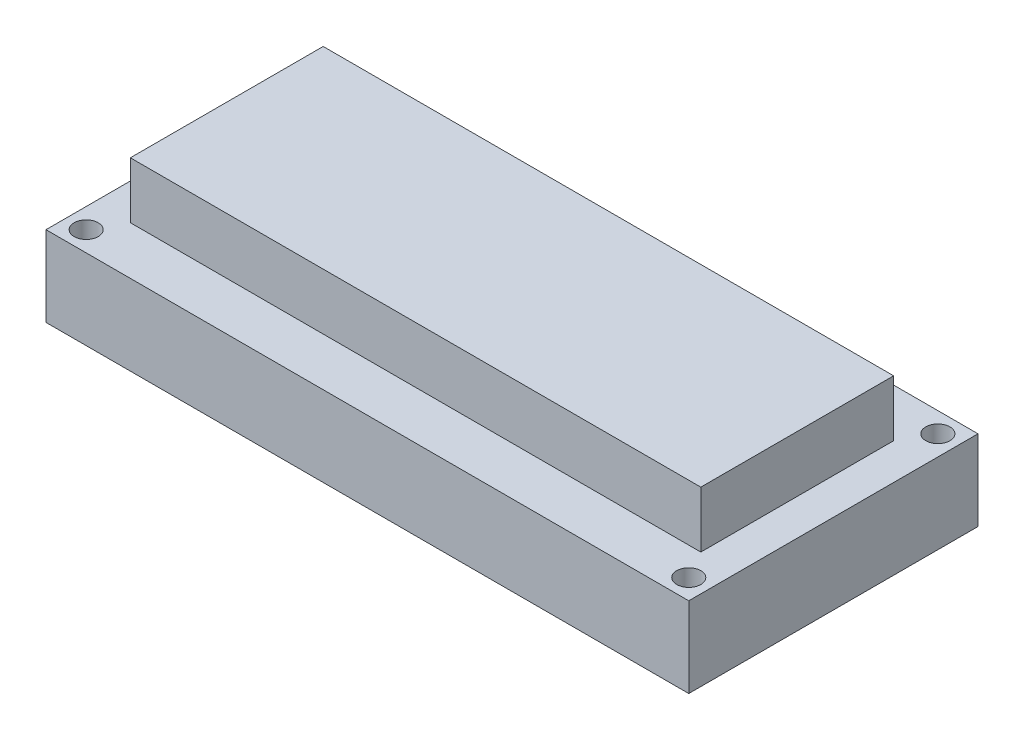
ISO-10303-21;
HEADER;
FILE_DESCRIPTION(('STEP AP214'),'2;1');
FILE_NAME('part.step','',(''),(''),'','','');
FILE_SCHEMA(('AUTOMOTIVE_DESIGN { 1 0 10303 214 1 1 1 1 }'));
ENDSEC;
DATA;
#1=APPLICATION_CONTEXT('core data for automotive mechanical design processes');
#2=APPLICATION_PROTOCOL_DEFINITION('international standard','automotive_design',2000,#1);
#3=PRODUCT_CONTEXT('',#1,'mechanical');
#4=PRODUCT('Part','Part','',(#3));
#5=PRODUCT_RELATED_PRODUCT_CATEGORY('part','',(#4));
#6=PRODUCT_DEFINITION_FORMATION('','',#4);
#7=PRODUCT_DEFINITION_CONTEXT('part definition',#1,'design');
#8=PRODUCT_DEFINITION('design','',#6,#7);
#9=PRODUCT_DEFINITION_SHAPE('','',#8);
#10=(LENGTH_UNIT() NAMED_UNIT(*) SI_UNIT(.MILLI.,.METRE.));
#11=(NAMED_UNIT(*) PLANE_ANGLE_UNIT() SI_UNIT($,.RADIAN.));
#12=(NAMED_UNIT(*) SI_UNIT($,.STERADIAN.) SOLID_ANGLE_UNIT());
#13=UNCERTAINTY_MEASURE_WITH_UNIT(LENGTH_MEASURE(1.E-05),#10,'distance_accuracy_value','');
#14=(GEOMETRIC_REPRESENTATION_CONTEXT(3) GLOBAL_UNCERTAINTY_ASSIGNED_CONTEXT((#13)) GLOBAL_UNIT_ASSIGNED_CONTEXT((#10,
#11,#12)) REPRESENTATION_CONTEXT('',''));
#15=CARTESIAN_POINT('',(0.,0.,0.));
#16=DIRECTION('',(0.,0.,1.));
#17=DIRECTION('',(1.,0.,0.));
#18=AXIS2_PLACEMENT_3D('',#15,#16,#17);
#19=CARTESIAN_POINT('',(-40.,-10.,0.));
#20=DIRECTION('',(1.,0.,0.));
#21=DIRECTION('',(0.,0.,-1.));
#22=AXIS2_PLACEMENT_3D('',#19,#20,#21);
#23=PLANE('',#22);
#24=DIRECTION('',(0.,0.,-1.));
#25=VECTOR('',#24,1.);
#26=CARTESIAN_POINT('',(-40.,0.,0.));
#27=LINE('',#26,#25);
#28=CARTESIAN_POINT('',(-40.,0.,18.));
#29=VERTEX_POINT('',#28);
#30=CARTESIAN_POINT('',(-40.,0.,-18.));
#31=VERTEX_POINT('',#30);
#32=EDGE_CURVE('E274',#29,#31,#27,.T.);
#33=ORIENTED_EDGE('',*,*,#32,.T.);
#34=DIRECTION('',(0.,1.,0.));
#35=VECTOR('',#34,1.);
#36=CARTESIAN_POINT('',(-40.,-10.,-18.));
#37=LINE('',#36,#35);
#38=CARTESIAN_POINT('',(-40.,-10.,-18.));
#39=VERTEX_POINT('',#38);
#40=EDGE_CURVE('E11',#39,#31,#37,.T.);
#41=ORIENTED_EDGE('',*,*,#40,.F.);
#42=DIRECTION('',(0.,0.,-1.));
#43=VECTOR('',#42,1.);
#44=CARTESIAN_POINT('',(-40.,-10.,0.));
#45=LINE('',#44,#43);
#46=CARTESIAN_POINT('',(-40.,-10.,18.));
#47=VERTEX_POINT('',#46);
#48=EDGE_CURVE('E245',#47,#39,#45,.T.);
#49=ORIENTED_EDGE('',*,*,#48,.F.);
#50=DIRECTION('',(0.,1.,0.));
#51=VECTOR('',#50,1.);
#52=CARTESIAN_POINT('',(-40.,-10.,18.));
#53=LINE('',#52,#51);
#54=EDGE_CURVE('E51',#47,#29,#53,.T.);
#55=ORIENTED_EDGE('',*,*,#54,.T.);
#56=EDGE_LOOP('',(#33,#41,#49,#55));
#57=FACE_BOUND('',#56,.T.);
#58=ADVANCED_FACE('F47',(#57),#23,.F.);
#59=CARTESIAN_POINT('',(0.,-10.,-18.));
#60=DIRECTION('',(0.,0.,-1.));
#61=DIRECTION('',(-1.,0.,0.));
#62=AXIS2_PLACEMENT_3D('',#59,#60,#61);
#63=PLANE('',#62);
#64=DIRECTION('',(-1.,0.,0.));
#65=VECTOR('',#64,1.);
#66=CARTESIAN_POINT('',(0.,0.,-18.));
#67=LINE('',#66,#65);
#68=CARTESIAN_POINT('',(40.,0.,-18.));
#69=VERTEX_POINT('',#68);
#70=EDGE_CURVE('E233',#69,#31,#67,.T.);
#71=ORIENTED_EDGE('',*,*,#70,.F.);
#72=DIRECTION('',(0.,1.,0.));
#73=VECTOR('',#72,1.);
#74=CARTESIAN_POINT('',(40.,-10.,-18.));
#75=LINE('',#74,#73);
#76=CARTESIAN_POINT('',(40.,-10.,-18.));
#77=VERTEX_POINT('',#76);
#78=EDGE_CURVE('E57',#77,#69,#75,.T.);
#79=ORIENTED_EDGE('',*,*,#78,.F.);
#80=DIRECTION('',(-1.,0.,0.));
#81=VECTOR('',#80,1.);
#82=CARTESIAN_POINT('',(0.,-10.,-18.));
#83=LINE('',#82,#81);
#84=EDGE_CURVE('E255',#77,#39,#83,.T.);
#85=ORIENTED_EDGE('',*,*,#84,.T.);
#86=ORIENTED_EDGE('',*,*,#40,.T.);
#87=EDGE_LOOP('',(#71,#79,#85,#86));
#88=FACE_BOUND('',#87,.T.);
#89=ADVANCED_FACE('F306',(#88),#63,.T.);
#90=CARTESIAN_POINT('',(40.,-10.,0.));
#91=DIRECTION('',(1.,0.,0.));
#92=DIRECTION('',(0.,0.,-1.));
#93=AXIS2_PLACEMENT_3D('',#90,#91,#92);
#94=PLANE('',#93);
#95=DIRECTION('',(0.,0.,-1.));
#96=VECTOR('',#95,1.);
#97=CARTESIAN_POINT('',(40.,0.,0.));
#98=LINE('',#97,#96);
#99=CARTESIAN_POINT('',(40.,0.,18.));
#100=VERTEX_POINT('',#99);
#101=EDGE_CURVE('E281',#100,#69,#98,.T.);
#102=ORIENTED_EDGE('',*,*,#101,.F.);
#103=DIRECTION('',(0.,1.,0.));
#104=VECTOR('',#103,1.);
#105=CARTESIAN_POINT('',(40.,-10.,18.));
#106=LINE('',#105,#104);
#107=CARTESIAN_POINT('',(40.,-10.,18.));
#108=VERTEX_POINT('',#107);
#109=EDGE_CURVE('E289',#108,#100,#106,.T.);
#110=ORIENTED_EDGE('',*,*,#109,.F.);
#111=DIRECTION('',(0.,0.,-1.));
#112=VECTOR('',#111,1.);
#113=CARTESIAN_POINT('',(40.,-10.,0.));
#114=LINE('',#113,#112);
#115=EDGE_CURVE('E251',#108,#77,#114,.T.);
#116=ORIENTED_EDGE('',*,*,#115,.T.);
#117=ORIENTED_EDGE('',*,*,#78,.T.);
#118=EDGE_LOOP('',(#102,#110,#116,#117));
#119=FACE_BOUND('',#118,.T.);
#120=ADVANCED_FACE('F328',(#119),#94,.T.);
#121=CARTESIAN_POINT('',(37.5,-10.,-15.5));
#122=DIRECTION('',(0.,1.,0.));
#123=DIRECTION('',(0.,0.,1.));
#124=AXIS2_PLACEMENT_3D('',#121,#122,#123);
#125=CYLINDRICAL_SURFACE('',#124,1.5);
#126=CARTESIAN_POINT('',(37.5,-10.,-15.5));
#127=DIRECTION('',(0.,1.,0.));
#128=DIRECTION('',(0.,0.,1.));
#129=AXIS2_PLACEMENT_3D('',#126,#127,#128);
#130=CIRCLE('',#129,1.5);
#131=CARTESIAN_POINT('',(37.5,-10.,-14.));
#132=VERTEX_POINT('',#131);
#133=EDGE_CURVE('E241',#132,#132,#130,.T.);
#134=ORIENTED_EDGE('',*,*,#133,.F.);
#135=EDGE_LOOP('',(#134));
#136=FACE_BOUND('',#135,.T.);
#137=CARTESIAN_POINT('',(37.5,0.,-15.5));
#138=DIRECTION('',(0.,1.,0.));
#139=DIRECTION('',(0.,0.,1.));
#140=AXIS2_PLACEMENT_3D('',#137,#138,#139);
#141=CIRCLE('',#140,1.5);
#142=CARTESIAN_POINT('',(37.5,0.,-14.));
#143=VERTEX_POINT('',#142);
#144=EDGE_CURVE('E270',#143,#143,#141,.T.);
#145=ORIENTED_EDGE('',*,*,#144,.T.);
#146=EDGE_LOOP('',(#145));
#147=FACE_BOUND('',#146,.T.);
#148=ADVANCED_FACE('F331',(#136,#147),#125,.F.);
#149=CARTESIAN_POINT('',(37.5,-10.,15.5));
#150=DIRECTION('',(0.,1.,0.));
#151=DIRECTION('',(0.,0.,1.));
#152=AXIS2_PLACEMENT_3D('',#149,#150,#151);
#153=CYLINDRICAL_SURFACE('',#152,1.5);
#154=CARTESIAN_POINT('',(37.5,-10.,15.5));
#155=DIRECTION('',(0.,1.,0.));
#156=DIRECTION('',(0.,0.,1.));
#157=AXIS2_PLACEMENT_3D('',#154,#155,#156);
#158=CIRCLE('',#157,1.5);
#159=CARTESIAN_POINT('',(37.5,-10.,17.));
#160=VERTEX_POINT('',#159);
#161=EDGE_CURVE('E237',#160,#160,#158,.T.);
#162=ORIENTED_EDGE('',*,*,#161,.F.);
#163=EDGE_LOOP('',(#162));
#164=FACE_BOUND('',#163,.T.);
#165=CARTESIAN_POINT('',(37.5,0.,15.5));
#166=DIRECTION('',(0.,1.,0.));
#167=DIRECTION('',(0.,0.,1.));
#168=AXIS2_PLACEMENT_3D('',#165,#166,#167);
#169=CIRCLE('',#168,1.5);
#170=CARTESIAN_POINT('',(37.5,0.,17.));
#171=VERTEX_POINT('',#170);
#172=EDGE_CURVE('E266',#171,#171,#169,.T.);
#173=ORIENTED_EDGE('',*,*,#172,.T.);
#174=EDGE_LOOP('',(#173));
#175=FACE_BOUND('',#174,.T.);
#176=ADVANCED_FACE('F334',(#164,#175),#153,.F.);
#177=CARTESIAN_POINT('',(-37.5,-10.,15.5));
#178=DIRECTION('',(0.,1.,0.));
#179=DIRECTION('',(0.,0.,1.));
#180=AXIS2_PLACEMENT_3D('',#177,#178,#179);
#181=CYLINDRICAL_SURFACE('',#180,1.5);
#182=CARTESIAN_POINT('',(-37.5,-10.,15.5));
#183=DIRECTION('',(0.,1.,0.));
#184=DIRECTION('',(0.,0.,1.));
#185=AXIS2_PLACEMENT_3D('',#182,#183,#184);
#186=CIRCLE('',#185,1.5);
#187=CARTESIAN_POINT('',(-37.5,-10.,17.));
#188=VERTEX_POINT('',#187);
#189=EDGE_CURVE('E232',#188,#188,#186,.T.);
#190=ORIENTED_EDGE('',*,*,#189,.F.);
#191=EDGE_LOOP('',(#190));
#192=FACE_BOUND('',#191,.T.);
#193=CARTESIAN_POINT('',(-37.5,0.,15.5));
#194=DIRECTION('',(0.,1.,0.));
#195=DIRECTION('',(0.,0.,1.));
#196=AXIS2_PLACEMENT_3D('',#193,#194,#195);
#197=CIRCLE('',#196,1.5);
#198=CARTESIAN_POINT('',(-37.5,0.,17.));
#199=VERTEX_POINT('',#198);
#200=EDGE_CURVE('E262',#199,#199,#197,.T.);
#201=ORIENTED_EDGE('',*,*,#200,.T.);
#202=EDGE_LOOP('',(#201));
#203=FACE_BOUND('',#202,.T.);
#204=ADVANCED_FACE('F320',(#192,#203),#181,.F.);
#205=CARTESIAN_POINT('',(-37.5,-10.,-15.5));
#206=DIRECTION('',(0.,1.,0.));
#207=DIRECTION('',(0.,0.,1.));
#208=AXIS2_PLACEMENT_3D('',#205,#206,#207);
#209=CYLINDRICAL_SURFACE('',#208,1.5);
#210=CARTESIAN_POINT('',(-37.5,-10.,-15.5));
#211=DIRECTION('',(0.,1.,0.));
#212=DIRECTION('',(0.,0.,1.));
#213=AXIS2_PLACEMENT_3D('',#210,#211,#212);
#214=CIRCLE('',#213,1.5);
#215=CARTESIAN_POINT('',(-37.5,-10.,-14.));
#216=VERTEX_POINT('',#215);
#217=EDGE_CURVE('E228',#216,#216,#214,.T.);
#218=ORIENTED_EDGE('',*,*,#217,.F.);
#219=EDGE_LOOP('',(#218));
#220=FACE_BOUND('',#219,.T.);
#221=CARTESIAN_POINT('',(-37.5,0.,-15.5));
#222=DIRECTION('',(0.,1.,0.));
#223=DIRECTION('',(0.,0.,1.));
#224=AXIS2_PLACEMENT_3D('',#221,#222,#223);
#225=CIRCLE('',#224,1.5);
#226=CARTESIAN_POINT('',(-37.5,0.,-14.));
#227=VERTEX_POINT('',#226);
#228=EDGE_CURVE('E227',#227,#227,#225,.T.);
#229=ORIENTED_EDGE('',*,*,#228,.T.);
#230=EDGE_LOOP('',(#229));
#231=FACE_BOUND('',#230,.T.);
#232=ADVANCED_FACE('F49',(#220,#231),#209,.F.);
#233=CARTESIAN_POINT('',(0.,-10.,18.));
#234=DIRECTION('',(0.,0.,-1.));
#235=DIRECTION('',(-1.,0.,0.));
#236=AXIS2_PLACEMENT_3D('',#233,#234,#235);
#237=PLANE('',#236);
#238=DIRECTION('',(-1.,0.,0.));
#239=VECTOR('',#238,1.);
#240=CARTESIAN_POINT('',(0.,0.,18.));
#241=LINE('',#240,#239);
#242=EDGE_CURVE('E278',#100,#29,#241,.T.);
#243=ORIENTED_EDGE('',*,*,#242,.T.);
#244=ORIENTED_EDGE('',*,*,#54,.F.);
#245=DIRECTION('',(-1.,0.,0.));
#246=VECTOR('',#245,1.);
#247=CARTESIAN_POINT('',(0.,-10.,18.));
#248=LINE('',#247,#246);
#249=EDGE_CURVE('E248',#108,#47,#248,.T.);
#250=ORIENTED_EDGE('',*,*,#249,.F.);
#251=ORIENTED_EDGE('',*,*,#109,.T.);
#252=EDGE_LOOP('',(#243,#244,#250,#251));
#253=FACE_BOUND('',#252,.T.);
#254=ADVANCED_FACE('F311',(#253),#237,.F.);
#255=CARTESIAN_POINT('',(0.,-10.,0.));
#256=DIRECTION('',(0.,1.,0.));
#257=DIRECTION('',(0.,0.,1.));
#258=AXIS2_PLACEMENT_3D('',#255,#256,#257);
#259=PLANE('',#258);
#260=ORIENTED_EDGE('',*,*,#217,.T.);
#261=EDGE_LOOP('',(#260));
#262=FACE_BOUND('',#261,.T.);
#263=ORIENTED_EDGE('',*,*,#189,.T.);
#264=EDGE_LOOP('',(#263));
#265=FACE_BOUND('',#264,.T.);
#266=ORIENTED_EDGE('',*,*,#161,.T.);
#267=EDGE_LOOP('',(#266));
#268=FACE_BOUND('',#267,.T.);
#269=ORIENTED_EDGE('',*,*,#133,.T.);
#270=EDGE_LOOP('',(#269));
#271=FACE_BOUND('',#270,.T.);
#272=ORIENTED_EDGE('',*,*,#48,.T.);
#273=ORIENTED_EDGE('',*,*,#84,.F.);
#274=ORIENTED_EDGE('',*,*,#115,.F.);
#275=ORIENTED_EDGE('',*,*,#249,.T.);
#276=EDGE_LOOP('',(#272,#273,#274,#275));
#277=FACE_BOUND('',#276,.T.);
#278=ADVANCED_FACE('F310',(#262,#265,#268,#271,#277),#259,.F.);
#279=CARTESIAN_POINT('',(0.,0.,0.));
#280=DIRECTION('',(0.,1.,0.));
#281=DIRECTION('',(0.,0.,1.));
#282=AXIS2_PLACEMENT_3D('',#279,#280,#281);
#283=PLANE('',#282);
#284=DIRECTION('',(0.768221279597376,0.,-0.64018439966448));
#285=VECTOR('',#284,1.);
#286=CARTESIAN_POINT('',(-16.5163934426229,0.,-19.8196721311475));
#287=LINE('',#286,#285);
#288=CARTESIAN_POINT('',(-38.5,0.,-1.5));
#289=VERTEX_POINT('',#288);
#290=CARTESIAN_POINT('',(-35.5,0.,-4.));
#291=VERTEX_POINT('',#290);
#292=EDGE_CURVE('E172',#289,#291,#287,.T.);
#293=ORIENTED_EDGE('',*,*,#292,.T.);
#294=DIRECTION('',(0.,0.,-1.));
#295=VECTOR('',#294,1.);
#296=CARTESIAN_POINT('',(-35.5,0.,0.));
#297=LINE('',#296,#295);
#298=CARTESIAN_POINT('',(-35.5,0.,-12.));
#299=VERTEX_POINT('',#298);
#300=EDGE_CURVE('E144',#291,#299,#297,.T.);
#301=ORIENTED_EDGE('',*,*,#300,.T.);
#302=DIRECTION('',(-1.,0.,0.));
#303=VECTOR('',#302,1.);
#304=CARTESIAN_POINT('',(0.,0.,-12.));
#305=LINE('',#304,#303);
#306=CARTESIAN_POINT('',(35.5,0.,-12.));
#307=VERTEX_POINT('',#306);
#308=EDGE_CURVE('E191',#307,#299,#305,.T.);
#309=ORIENTED_EDGE('',*,*,#308,.F.);
#310=DIRECTION('',(0.,0.,-1.));
#311=VECTOR('',#310,1.);
#312=CARTESIAN_POINT('',(35.5,0.,0.));
#313=LINE('',#312,#311);
#314=CARTESIAN_POINT('',(35.5,0.,12.));
#315=VERTEX_POINT('',#314);
#316=EDGE_CURVE('E209',#315,#307,#313,.T.);
#317=ORIENTED_EDGE('',*,*,#316,.F.);
#318=DIRECTION('',(-1.,0.,0.));
#319=VECTOR('',#318,1.);
#320=CARTESIAN_POINT('',(0.,0.,12.));
#321=LINE('',#320,#319);
#322=CARTESIAN_POINT('',(-35.5,0.,12.));
#323=VERTEX_POINT('',#322);
#324=EDGE_CURVE('E205',#315,#323,#321,.T.);
#325=ORIENTED_EDGE('',*,*,#324,.T.);
#326=CARTESIAN_POINT('',(-35.5,0.,4.));
#327=VERTEX_POINT('',#326);
#328=EDGE_CURVE('E202',#323,#327,#297,.T.);
#329=ORIENTED_EDGE('',*,*,#328,.T.);
#330=DIRECTION('',(0.768221279597376,0.,0.640184399664479));
#331=VECTOR('',#330,1.);
#332=CARTESIAN_POINT('',(-16.5163934426229,0.,19.8196721311475));
#333=LINE('',#332,#331);
#334=CARTESIAN_POINT('',(-38.5,0.,1.5));
#335=VERTEX_POINT('',#334);
#336=EDGE_CURVE('E70',#335,#327,#333,.T.);
#337=ORIENTED_EDGE('',*,*,#336,.F.);
#338=DIRECTION('',(0.,0.,-1.));
#339=VECTOR('',#338,1.);
#340=CARTESIAN_POINT('',(-38.5,0.,0.));
#341=LINE('',#340,#339);
#342=EDGE_CURVE('E65',#335,#289,#341,.T.);
#343=ORIENTED_EDGE('',*,*,#342,.T.);
#344=EDGE_LOOP('',(#293,#301,#309,#317,#325,#329,#337,#343));
#345=FACE_BOUND('',#344,.T.);
#346=ORIENTED_EDGE('',*,*,#228,.F.);
#347=EDGE_LOOP('',(#346));
#348=FACE_BOUND('',#347,.T.);
#349=ORIENTED_EDGE('',*,*,#200,.F.);
#350=EDGE_LOOP('',(#349));
#351=FACE_BOUND('',#350,.T.);
#352=ORIENTED_EDGE('',*,*,#172,.F.);
#353=EDGE_LOOP('',(#352));
#354=FACE_BOUND('',#353,.T.);
#355=ORIENTED_EDGE('',*,*,#144,.F.);
#356=EDGE_LOOP('',(#355));
#357=FACE_BOUND('',#356,.T.);
#358=ORIENTED_EDGE('',*,*,#32,.F.);
#359=ORIENTED_EDGE('',*,*,#242,.F.);
#360=ORIENTED_EDGE('',*,*,#101,.T.);
#361=ORIENTED_EDGE('',*,*,#70,.T.);
#362=EDGE_LOOP('',(#358,#359,#360,#361));
#363=FACE_BOUND('',#362,.T.);
#364=ADVANCED_FACE('F302',(#345,#348,#351,#354,#357,#363),#283,.T.);
#365=CARTESIAN_POINT('',(-35.5,7.,0.));
#366=DIRECTION('',(-1.,0.,0.));
#367=DIRECTION('',(0.,0.,1.));
#368=AXIS2_PLACEMENT_3D('',#365,#366,#367);
#369=PLANE('',#368);
#370=DIRECTION('',(0.,-1.,0.));
#371=VECTOR('',#370,1.);
#372=CARTESIAN_POINT('',(-35.5,3.,-4.));
#373=LINE('',#372,#371);
#374=CARTESIAN_POINT('',(-35.5,3.,-4.));
#375=VERTEX_POINT('',#374);
#376=EDGE_CURVE('E138',#375,#291,#373,.T.);
#377=ORIENTED_EDGE('',*,*,#376,.F.);
#378=DIRECTION('',(0.,0.,-1.));
#379=VECTOR('',#378,1.);
#380=CARTESIAN_POINT('',(-35.5,3.,0.));
#381=LINE('',#380,#379);
#382=CARTESIAN_POINT('',(-35.5,3.,4.));
#383=VERTEX_POINT('',#382);
#384=EDGE_CURVE('E141',#383,#375,#381,.T.);
#385=ORIENTED_EDGE('',*,*,#384,.F.);
#386=DIRECTION('',(0.,-1.,0.));
#387=VECTOR('',#386,1.);
#388=CARTESIAN_POINT('',(-35.5,3.,4.));
#389=LINE('',#388,#387);
#390=EDGE_CURVE('E171',#383,#327,#389,.T.);
#391=ORIENTED_EDGE('',*,*,#390,.T.);
#392=ORIENTED_EDGE('',*,*,#328,.F.);
#393=DIRECTION('',(0.,-1.,0.));
#394=VECTOR('',#393,1.);
#395=CARTESIAN_POINT('',(-35.5,7.,12.));
#396=LINE('',#395,#394);
#397=CARTESIAN_POINT('',(-35.5,7.,12.));
#398=VERTEX_POINT('',#397);
#399=EDGE_CURVE('E224',#398,#323,#396,.T.);
#400=ORIENTED_EDGE('',*,*,#399,.F.);
#401=DIRECTION('',(0.,0.,-1.));
#402=VECTOR('',#401,1.);
#403=CARTESIAN_POINT('',(-35.5,7.,0.));
#404=LINE('',#403,#402);
#405=CARTESIAN_POINT('',(-35.5,7.,-12.));
#406=VERTEX_POINT('',#405);
#407=EDGE_CURVE('E186',#398,#406,#404,.T.);
#408=ORIENTED_EDGE('',*,*,#407,.T.);
#409=DIRECTION('',(0.,-1.,0.));
#410=VECTOR('',#409,1.);
#411=CARTESIAN_POINT('',(-35.5,7.,-12.));
#412=LINE('',#411,#410);
#413=EDGE_CURVE('E201',#406,#299,#412,.T.);
#414=ORIENTED_EDGE('',*,*,#413,.T.);
#415=ORIENTED_EDGE('',*,*,#300,.F.);
#416=EDGE_LOOP('',(#377,#385,#391,#392,#400,#408,#414,#415));
#417=FACE_BOUND('',#416,.T.);
#418=ADVANCED_FACE('F140',(#417),#369,.T.);
#419=CARTESIAN_POINT('',(0.,7.,12.));
#420=DIRECTION('',(0.,0.,1.));
#421=DIRECTION('',(1.,0.,0.));
#422=AXIS2_PLACEMENT_3D('',#419,#420,#421);
#423=PLANE('',#422);
#424=ORIENTED_EDGE('',*,*,#324,.F.);
#425=DIRECTION('',(0.,-1.,0.));
#426=VECTOR('',#425,1.);
#427=CARTESIAN_POINT('',(35.5,7.,12.));
#428=LINE('',#427,#426);
#429=CARTESIAN_POINT('',(35.5,7.,12.));
#430=VERTEX_POINT('',#429);
#431=EDGE_CURVE('E221',#430,#315,#428,.T.);
#432=ORIENTED_EDGE('',*,*,#431,.F.);
#433=DIRECTION('',(-1.,0.,0.));
#434=VECTOR('',#433,1.);
#435=CARTESIAN_POINT('',(0.,7.,12.));
#436=LINE('',#435,#434);
#437=EDGE_CURVE('E190',#430,#398,#436,.T.);
#438=ORIENTED_EDGE('',*,*,#437,.T.);
#439=ORIENTED_EDGE('',*,*,#399,.T.);
#440=EDGE_LOOP('',(#424,#432,#438,#439));
#441=FACE_BOUND('',#440,.T.);
#442=ADVANCED_FACE('F358',(#441),#423,.T.);
#443=CARTESIAN_POINT('',(35.5,7.,0.));
#444=DIRECTION('',(-1.,0.,0.));
#445=DIRECTION('',(0.,0.,1.));
#446=AXIS2_PLACEMENT_3D('',#443,#444,#445);
#447=PLANE('',#446);
#448=ORIENTED_EDGE('',*,*,#316,.T.);
#449=DIRECTION('',(0.,-1.,0.));
#450=VECTOR('',#449,1.);
#451=CARTESIAN_POINT('',(35.5,7.,-12.));
#452=LINE('',#451,#450);
#453=CARTESIAN_POINT('',(35.5,7.,-12.));
#454=VERTEX_POINT('',#453);
#455=EDGE_CURVE('E218',#454,#307,#452,.T.);
#456=ORIENTED_EDGE('',*,*,#455,.F.);
#457=DIRECTION('',(0.,0.,-1.));
#458=VECTOR('',#457,1.);
#459=CARTESIAN_POINT('',(35.5,7.,0.));
#460=LINE('',#459,#458);
#461=EDGE_CURVE('E195',#430,#454,#460,.T.);
#462=ORIENTED_EDGE('',*,*,#461,.F.);
#463=ORIENTED_EDGE('',*,*,#431,.T.);
#464=EDGE_LOOP('',(#448,#456,#462,#463));
#465=FACE_BOUND('',#464,.T.);
#466=ADVANCED_FACE('F418',(#465),#447,.F.);
#467=CARTESIAN_POINT('',(0.,7.,-12.));
#468=DIRECTION('',(0.,0.,1.));
#469=DIRECTION('',(1.,0.,0.));
#470=AXIS2_PLACEMENT_3D('',#467,#468,#469);
#471=PLANE('',#470);
#472=ORIENTED_EDGE('',*,*,#308,.T.);
#473=ORIENTED_EDGE('',*,*,#413,.F.);
#474=DIRECTION('',(-1.,0.,0.));
#475=VECTOR('',#474,1.);
#476=CARTESIAN_POINT('',(0.,7.,-12.));
#477=LINE('',#476,#475);
#478=EDGE_CURVE('E198',#454,#406,#477,.T.);
#479=ORIENTED_EDGE('',*,*,#478,.F.);
#480=ORIENTED_EDGE('',*,*,#455,.T.);
#481=EDGE_LOOP('',(#472,#473,#479,#480));
#482=FACE_BOUND('',#481,.T.);
#483=ADVANCED_FACE('F428',(#482),#471,.F.);
#484=CARTESIAN_POINT('',(0.,7.,0.));
#485=DIRECTION('',(0.,1.,0.));
#486=DIRECTION('',(0.,0.,1.));
#487=AXIS2_PLACEMENT_3D('',#484,#485,#486);
#488=PLANE('',#487);
#489=ORIENTED_EDGE('',*,*,#407,.F.);
#490=ORIENTED_EDGE('',*,*,#437,.F.);
#491=ORIENTED_EDGE('',*,*,#461,.T.);
#492=ORIENTED_EDGE('',*,*,#478,.T.);
#493=EDGE_LOOP('',(#489,#490,#491,#492));
#494=FACE_BOUND('',#493,.T.);
#495=ADVANCED_FACE('F438',(#494),#488,.T.);
#496=CARTESIAN_POINT('',(-16.5163934426229,3.,-19.8196721311475));
#497=DIRECTION('',(-0.640184399664479,0.,-0.768221279597376));
#498=DIRECTION('',(-0.768221279597376,0.,0.64018439966448));
#499=AXIS2_PLACEMENT_3D('',#496,#497,#498);
#500=PLANE('',#499);
#501=ORIENTED_EDGE('',*,*,#292,.F.);
#502=DIRECTION('',(0.,-1.,0.));
#503=VECTOR('',#502,1.);
#504=CARTESIAN_POINT('',(-38.5,3.,-1.5));
#505=LINE('',#504,#503);
#506=CARTESIAN_POINT('',(-38.5,3.,-1.5));
#507=VERTEX_POINT('',#506);
#508=EDGE_CURVE('E149',#507,#289,#505,.T.);
#509=ORIENTED_EDGE('',*,*,#508,.F.);
#510=DIRECTION('',(0.768221279597376,0.,-0.64018439966448));
#511=VECTOR('',#510,1.);
#512=CARTESIAN_POINT('',(-16.5163934426229,3.,-19.8196721311475));
#513=LINE('',#512,#511);
#514=EDGE_CURVE('E155',#507,#375,#513,.T.);
#515=ORIENTED_EDGE('',*,*,#514,.T.);
#516=ORIENTED_EDGE('',*,*,#376,.T.);
#517=EDGE_LOOP('',(#501,#509,#515,#516));
#518=FACE_BOUND('',#517,.T.);
#519=ADVANCED_FACE('F162',(#518),#500,.T.);
#520=CARTESIAN_POINT('',(-38.5,3.,0.));
#521=DIRECTION('',(-1.,0.,0.));
#522=DIRECTION('',(0.,0.,1.));
#523=AXIS2_PLACEMENT_3D('',#520,#521,#522);
#524=PLANE('',#523);
#525=ORIENTED_EDGE('',*,*,#342,.F.);
#526=DIRECTION('',(0.,-1.,0.));
#527=VECTOR('',#526,1.);
#528=CARTESIAN_POINT('',(-38.5,3.,1.5));
#529=LINE('',#528,#527);
#530=CARTESIAN_POINT('',(-38.5,3.,1.5));
#531=VERTEX_POINT('',#530);
#532=EDGE_CURVE('E181',#531,#335,#529,.T.);
#533=ORIENTED_EDGE('',*,*,#532,.F.);
#534=DIRECTION('',(0.,0.,-1.));
#535=VECTOR('',#534,1.);
#536=CARTESIAN_POINT('',(-38.5,3.,0.));
#537=LINE('',#536,#535);
#538=EDGE_CURVE('E164',#531,#507,#537,.T.);
#539=ORIENTED_EDGE('',*,*,#538,.T.);
#540=ORIENTED_EDGE('',*,*,#508,.T.);
#541=EDGE_LOOP('',(#525,#533,#539,#540));
#542=FACE_BOUND('',#541,.T.);
#543=ADVANCED_FACE('F455',(#542),#524,.T.);
#544=CARTESIAN_POINT('',(-16.5163934426229,3.,19.8196721311475));
#545=DIRECTION('',(0.640184399664479,0.,-0.768221279597376));
#546=DIRECTION('',(-0.768221279597376,0.,-0.64018439966448));
#547=AXIS2_PLACEMENT_3D('',#544,#545,#546);
#548=PLANE('',#547);
#549=ORIENTED_EDGE('',*,*,#336,.T.);
#550=ORIENTED_EDGE('',*,*,#390,.F.);
#551=DIRECTION('',(0.768221279597376,0.,0.640184399664479));
#552=VECTOR('',#551,1.);
#553=CARTESIAN_POINT('',(-16.5163934426229,3.,19.8196721311475));
#554=LINE('',#553,#552);
#555=EDGE_CURVE('E158',#531,#383,#554,.T.);
#556=ORIENTED_EDGE('',*,*,#555,.F.);
#557=ORIENTED_EDGE('',*,*,#532,.T.);
#558=EDGE_LOOP('',(#549,#550,#556,#557));
#559=FACE_BOUND('',#558,.T.);
#560=ADVANCED_FACE('F464',(#559),#548,.F.);
#561=CARTESIAN_POINT('',(0.,3.,0.));
#562=DIRECTION('',(0.,1.,0.));
#563=DIRECTION('',(0.,0.,1.));
#564=AXIS2_PLACEMENT_3D('',#561,#562,#563);
#565=PLANE('',#564);
#566=ORIENTED_EDGE('',*,*,#384,.T.);
#567=ORIENTED_EDGE('',*,*,#514,.F.);
#568=ORIENTED_EDGE('',*,*,#538,.F.);
#569=ORIENTED_EDGE('',*,*,#555,.T.);
#570=EDGE_LOOP('',(#566,#567,#568,#569));
#571=FACE_BOUND('',#570,.T.);
#572=ADVANCED_FACE('F153',(#571),#565,.T.);
#573=CLOSED_SHELL('',(#58,#89,#120,#148,#176,#204,#232,#254,#278,#364,#418,#442,#466,#483,#495,
#519,#543,#560,#572));
#574=MANIFOLD_SOLID_BREP('B2',#573);
#575=ADVANCED_BREP_SHAPE_REPRESENTATION('',(#18,#574),#14);
#576=SHAPE_DEFINITION_REPRESENTATION(#9,#575);
ENDSEC;
END-ISO-10303-21;
